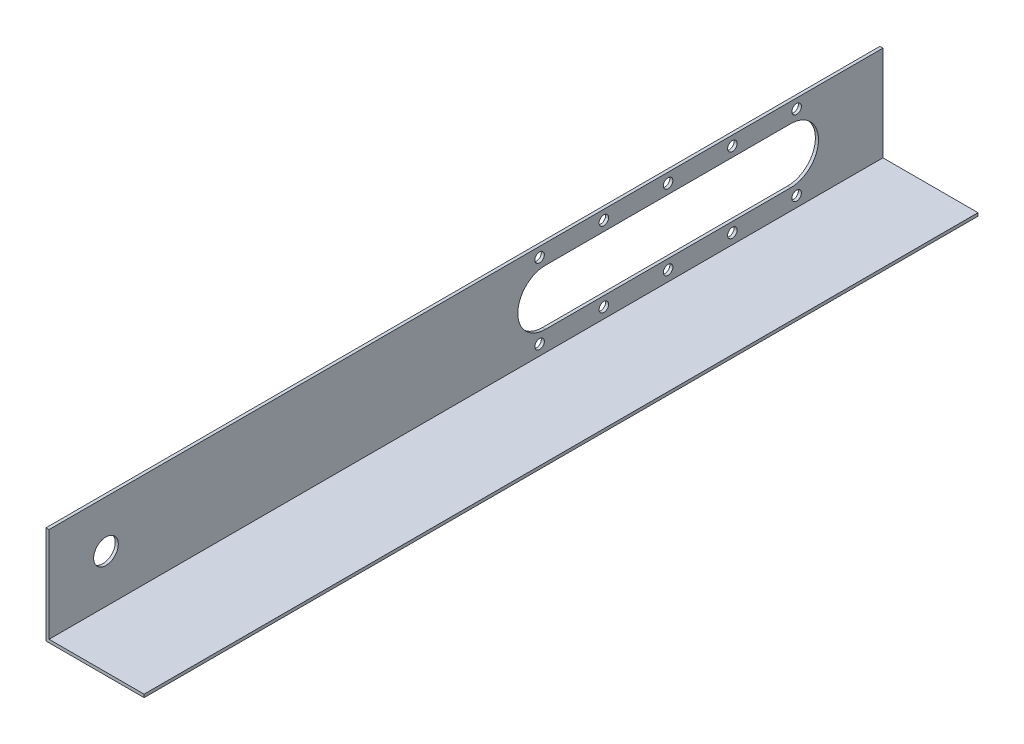
ISO-10303-21;
HEADER;
FILE_DESCRIPTION(('STEP AP214'),'2;1');
FILE_NAME('part.step','',(''),(''),'','','');
FILE_SCHEMA(('AUTOMOTIVE_DESIGN { 1 0 10303 214 1 1 1 1 }'));
ENDSEC;
DATA;
#1=APPLICATION_CONTEXT('core data for automotive mechanical design processes');
#2=APPLICATION_PROTOCOL_DEFINITION('international standard','automotive_design',2000,#1);
#3=PRODUCT_CONTEXT('',#1,'mechanical');
#4=PRODUCT('Part','Part','',(#3));
#5=PRODUCT_RELATED_PRODUCT_CATEGORY('part','',(#4));
#6=PRODUCT_DEFINITION_FORMATION('','',#4);
#7=PRODUCT_DEFINITION_CONTEXT('part definition',#1,'design');
#8=PRODUCT_DEFINITION('design','',#6,#7);
#9=PRODUCT_DEFINITION_SHAPE('','',#8);
#10=(LENGTH_UNIT() NAMED_UNIT(*) SI_UNIT(.MILLI.,.METRE.));
#11=(NAMED_UNIT(*) PLANE_ANGLE_UNIT() SI_UNIT($,.RADIAN.));
#12=(NAMED_UNIT(*) SI_UNIT($,.STERADIAN.) SOLID_ANGLE_UNIT());
#13=UNCERTAINTY_MEASURE_WITH_UNIT(LENGTH_MEASURE(1.E-05),#10,'distance_accuracy_value','');
#14=(GEOMETRIC_REPRESENTATION_CONTEXT(3) GLOBAL_UNCERTAINTY_ASSIGNED_CONTEXT((#13)) GLOBAL_UNIT_ASSIGNED_CONTEXT((#10,
#11,#12)) REPRESENTATION_CONTEXT('',''));
#15=CARTESIAN_POINT('',(0.,0.,0.));
#16=DIRECTION('',(0.,0.,1.));
#17=DIRECTION('',(1.,0.,0.));
#18=AXIS2_PLACEMENT_3D('',#15,#16,#17);
#19=CARTESIAN_POINT('',(0.,0.,431.8));
#20=DIRECTION('',(-1.,0.,0.));
#21=DIRECTION('',(0.,-1.,0.));
#22=AXIS2_PLACEMENT_3D('',#19,#20,#21);
#23=PLANE('',#22);
#24=CARTESIAN_POINT('',(0.,44.2595,111.252));
#25=DIRECTION('',(1.,0.,0.));
#26=DIRECTION('',(0.,0.,-1.));
#27=AXIS2_PLACEMENT_3D('',#24,#25,#26);
#28=CIRCLE('',#27,2.45744999999999);
#29=CARTESIAN_POINT('',(0.,44.2595,108.79455));
#30=VERTEX_POINT('',#29);
#31=EDGE_CURVE('E457',#30,#30,#28,.T.);
#32=ORIENTED_EDGE('',*,*,#31,.F.);
#33=EDGE_LOOP('',(#32));
#34=FACE_BOUND('',#33,.T.);
#35=CARTESIAN_POINT('',(0.,44.2595,144.526));
#36=DIRECTION('',(1.,0.,0.));
#37=DIRECTION('',(0.,0.,-1.));
#38=AXIS2_PLACEMENT_3D('',#35,#36,#37);
#39=CIRCLE('',#38,2.45744999999999);
#40=CARTESIAN_POINT('',(0.,44.2595,142.06855));
#41=VERTEX_POINT('',#40);
#42=EDGE_CURVE('E261',#41,#41,#39,.T.);
#43=ORIENTED_EDGE('',*,*,#42,.F.);
#44=EDGE_LOOP('',(#43));
#45=FACE_BOUND('',#44,.T.);
#46=CARTESIAN_POINT('',(0.,5.39749999999999,111.252));
#47=DIRECTION('',(1.,0.,0.));
#48=DIRECTION('',(0.,0.,-1.));
#49=AXIS2_PLACEMENT_3D('',#46,#47,#48);
#50=CIRCLE('',#49,2.45744999999999);
#51=CARTESIAN_POINT('',(0.,5.39749999999999,108.79455));
#52=VERTEX_POINT('',#51);
#53=EDGE_CURVE('E258',#52,#52,#50,.T.);
#54=ORIENTED_EDGE('',*,*,#53,.F.);
#55=EDGE_LOOP('',(#54));
#56=FACE_BOUND('',#55,.T.);
#57=CARTESIAN_POINT('',(0.,5.39749999999999,144.526));
#58=DIRECTION('',(1.,0.,0.));
#59=DIRECTION('',(0.,0.,-1.));
#60=AXIS2_PLACEMENT_3D('',#57,#58,#59);
#61=CIRCLE('',#60,2.45744999999999);
#62=CARTESIAN_POINT('',(0.,5.39749999999999,142.06855));
#63=VERTEX_POINT('',#62);
#64=EDGE_CURVE('E270',#63,#63,#61,.T.);
#65=ORIENTED_EDGE('',*,*,#64,.F.);
#66=EDGE_LOOP('',(#65));
#67=FACE_BOUND('',#66,.T.);
#68=CARTESIAN_POINT('',(0.,5.39749999999999,177.8));
#69=DIRECTION('',(1.,0.,0.));
#70=DIRECTION('',(0.,0.,-1.));
#71=AXIS2_PLACEMENT_3D('',#68,#69,#70);
#72=CIRCLE('',#71,2.45744999999999);
#73=CARTESIAN_POINT('',(0.,5.39749999999999,175.34255));
#74=VERTEX_POINT('',#73);
#75=EDGE_CURVE('E276',#74,#74,#72,.T.);
#76=ORIENTED_EDGE('',*,*,#75,.F.);
#77=EDGE_LOOP('',(#76));
#78=FACE_BOUND('',#77,.T.);
#79=CARTESIAN_POINT('',(0.,44.2595,77.978));
#80=DIRECTION('',(1.,0.,0.));
#81=DIRECTION('',(0.,0.,-1.));
#82=AXIS2_PLACEMENT_3D('',#79,#80,#81);
#83=CIRCLE('',#82,2.45744999999999);
#84=CARTESIAN_POINT('',(0.,44.2595,75.52055));
#85=VERTEX_POINT('',#84);
#86=EDGE_CURVE('E282',#85,#85,#83,.T.);
#87=ORIENTED_EDGE('',*,*,#86,.F.);
#88=EDGE_LOOP('',(#87));
#89=FACE_BOUND('',#88,.T.);
#90=CARTESIAN_POINT('',(0.,44.2595,44.704));
#91=DIRECTION('',(1.,0.,0.));
#92=DIRECTION('',(0.,0.,-1.));
#93=AXIS2_PLACEMENT_3D('',#90,#91,#92);
#94=CIRCLE('',#93,2.45744999999999);
#95=CARTESIAN_POINT('',(0.,44.2595,42.24655));
#96=VERTEX_POINT('',#95);
#97=EDGE_CURVE('E288',#96,#96,#94,.T.);
#98=ORIENTED_EDGE('',*,*,#97,.F.);
#99=EDGE_LOOP('',(#98));
#100=FACE_BOUND('',#99,.T.);
#101=CARTESIAN_POINT('',(0.,5.39749999999999,44.704));
#102=DIRECTION('',(1.,0.,0.));
#103=DIRECTION('',(0.,0.,-1.));
#104=AXIS2_PLACEMENT_3D('',#101,#102,#103);
#105=CIRCLE('',#104,2.45744999999999);
#106=CARTESIAN_POINT('',(0.,5.39749999999999,42.24655));
#107=VERTEX_POINT('',#106);
#108=EDGE_CURVE('E294',#107,#107,#105,.T.);
#109=ORIENTED_EDGE('',*,*,#108,.F.);
#110=EDGE_LOOP('',(#109));
#111=FACE_BOUND('',#110,.T.);
#112=CARTESIAN_POINT('',(0.,5.39749999999999,77.978));
#113=DIRECTION('',(1.,0.,0.));
#114=DIRECTION('',(0.,0.,-1.));
#115=AXIS2_PLACEMENT_3D('',#112,#113,#114);
#116=CIRCLE('',#115,2.45744999999999);
#117=CARTESIAN_POINT('',(0.,5.39749999999999,75.52055));
#118=VERTEX_POINT('',#117);
#119=EDGE_CURVE('E300',#118,#118,#116,.T.);
#120=ORIENTED_EDGE('',*,*,#119,.F.);
#121=EDGE_LOOP('',(#120));
#122=FACE_BOUND('',#121,.T.);
#123=CARTESIAN_POINT('',(0.,24.7735948291677,402.336));
#124=DIRECTION('',(1.,0.,0.));
#125=DIRECTION('',(0.,1.,0.));
#126=AXIS2_PLACEMENT_3D('',#123,#124,#125);
#127=CIRCLE('',#126,6.38810000000003);
#128=CARTESIAN_POINT('',(0.,31.1616948291677,402.336));
#129=VERTEX_POINT('',#128);
#130=EDGE_CURVE('E306',#129,#129,#127,.T.);
#131=ORIENTED_EDGE('',*,*,#130,.F.);
#132=EDGE_LOOP('',(#131));
#133=FACE_BOUND('',#132,.T.);
#134=DIRECTION('',(0.,0.,-1.));
#135=VECTOR('',#134,1.);
#136=CARTESIAN_POINT('',(0.,10.4775,174.752));
#137=LINE('',#136,#135);
#138=CARTESIAN_POINT('',(0.,10.4775,174.752));
#139=VERTEX_POINT('',#138);
#140=CARTESIAN_POINT('',(0.,10.4775,47.752));
#141=VERTEX_POINT('',#140);
#142=EDGE_CURVE('E124',#139,#141,#137,.T.);
#143=ORIENTED_EDGE('',*,*,#142,.F.);
#144=CARTESIAN_POINT('',(0.,24.8285,174.752));
#145=DIRECTION('',(1.,0.,0.));
#146=DIRECTION('',(0.,1.,0.));
#147=AXIS2_PLACEMENT_3D('',#144,#145,#146);
#148=CIRCLE('',#147,14.351);
#149=CARTESIAN_POINT('',(0.,39.1795,174.752));
#150=VERTEX_POINT('',#149);
#151=EDGE_CURVE('E50',#150,#139,#148,.T.);
#152=ORIENTED_EDGE('',*,*,#151,.F.);
#153=DIRECTION('',(0.,0.,1.));
#154=VECTOR('',#153,1.);
#155=CARTESIAN_POINT('',(0.,39.1795,174.752));
#156=LINE('',#155,#154);
#157=CARTESIAN_POINT('',(0.,39.1795,47.752));
#158=VERTEX_POINT('',#157);
#159=EDGE_CURVE('E130',#158,#150,#156,.T.);
#160=ORIENTED_EDGE('',*,*,#159,.F.);
#161=CARTESIAN_POINT('',(0.,24.8285,47.752));
#162=DIRECTION('',(1.,0.,0.));
#163=DIRECTION('',(0.,1.,0.));
#164=AXIS2_PLACEMENT_3D('',#161,#162,#163);
#165=CIRCLE('',#164,14.351);
#166=EDGE_CURVE('E115',#141,#158,#165,.T.);
#167=ORIENTED_EDGE('',*,*,#166,.F.);
#168=EDGE_LOOP('',(#143,#152,#160,#167));
#169=FACE_BOUND('',#168,.T.);
#170=DIRECTION('',(0.,1.,0.));
#171=VECTOR('',#170,1.);
#172=CARTESIAN_POINT('',(0.,0.,0.));
#173=LINE('',#172,#171);
#174=CARTESIAN_POINT('',(0.,0.,0.));
#175=VERTEX_POINT('',#174);
#176=CARTESIAN_POINT('',(0.,49.2125,0.));
#177=VERTEX_POINT('',#176);
#178=EDGE_CURVE('E157',#175,#177,#173,.T.);
#179=ORIENTED_EDGE('',*,*,#178,.T.);
#180=DIRECTION('',(0.,0.,-1.));
#181=VECTOR('',#180,1.);
#182=CARTESIAN_POINT('',(0.,49.2125,431.8));
#183=LINE('',#182,#181);
#184=CARTESIAN_POINT('',(0.,49.2125,431.8));
#185=VERTEX_POINT('',#184);
#186=EDGE_CURVE('E177',#185,#177,#183,.T.);
#187=ORIENTED_EDGE('',*,*,#186,.F.);
#188=DIRECTION('',(0.,1.,0.));
#189=VECTOR('',#188,1.);
#190=CARTESIAN_POINT('',(0.,0.,431.8));
#191=LINE('',#190,#189);
#192=CARTESIAN_POINT('',(0.,0.,431.8));
#193=VERTEX_POINT('',#192);
#194=EDGE_CURVE('E143',#193,#185,#191,.T.);
#195=ORIENTED_EDGE('',*,*,#194,.F.);
#196=DIRECTION('',(0.,0.,-1.));
#197=VECTOR('',#196,1.);
#198=CARTESIAN_POINT('',(0.,0.,431.8));
#199=LINE('',#198,#197);
#200=EDGE_CURVE('E180',#193,#175,#199,.T.);
#201=ORIENTED_EDGE('',*,*,#200,.T.);
#202=EDGE_LOOP('',(#179,#187,#195,#201));
#203=FACE_BOUND('',#202,.T.);
#204=CARTESIAN_POINT('',(0.,44.2595,177.8));
#205=DIRECTION('',(1.,0.,0.));
#206=DIRECTION('',(0.,0.,-1.));
#207=AXIS2_PLACEMENT_3D('',#204,#205,#206);
#208=CIRCLE('',#207,2.45744999999999);
#209=CARTESIAN_POINT('',(0.,44.2595,175.34255));
#210=VERTEX_POINT('',#209);
#211=EDGE_CURVE('E252',#210,#210,#208,.T.);
#212=ORIENTED_EDGE('',*,*,#211,.F.);
#213=EDGE_LOOP('',(#212));
#214=FACE_BOUND('',#213,.T.);
#215=ADVANCED_FACE('F35',(#34,#45,#56,#67,#78,#89,#100,#111,#122,#133,#169,#203,#214),#23,.F.);
#216=CARTESIAN_POINT('',(49.2125,0.,431.8));
#217=DIRECTION('',(0.,-1.,0.));
#218=DIRECTION('',(1.,0.,0.));
#219=AXIS2_PLACEMENT_3D('',#216,#217,#218);
#220=PLANE('',#219);
#221=DIRECTION('',(-1.,0.,0.));
#222=VECTOR('',#221,1.);
#223=CARTESIAN_POINT('',(49.2125,0.,0.));
#224=LINE('',#223,#222);
#225=CARTESIAN_POINT('',(49.2125,0.,0.));
#226=VERTEX_POINT('',#225);
#227=EDGE_CURVE('E137',#226,#175,#224,.T.);
#228=ORIENTED_EDGE('',*,*,#227,.T.);
#229=ORIENTED_EDGE('',*,*,#200,.F.);
#230=DIRECTION('',(-1.,0.,0.));
#231=VECTOR('',#230,1.);
#232=CARTESIAN_POINT('',(49.2125,0.,431.8));
#233=LINE('',#232,#231);
#234=CARTESIAN_POINT('',(49.2125,0.,431.8));
#235=VERTEX_POINT('',#234);
#236=EDGE_CURVE('E140',#235,#193,#233,.T.);
#237=ORIENTED_EDGE('',*,*,#236,.F.);
#238=DIRECTION('',(0.,0.,-1.));
#239=VECTOR('',#238,1.);
#240=CARTESIAN_POINT('',(49.2125,0.,431.8));
#241=LINE('',#240,#239);
#242=EDGE_CURVE('E154',#235,#226,#241,.T.);
#243=ORIENTED_EDGE('',*,*,#242,.T.);
#244=EDGE_LOOP('',(#228,#229,#237,#243));
#245=FACE_BOUND('',#244,.T.);
#246=ADVANCED_FACE('F37',(#245),#220,.F.);
#247=CARTESIAN_POINT('',(0.,49.2125,431.8));
#248=DIRECTION('',(0.,-1.,0.));
#249=DIRECTION('',(1.,0.,0.));
#250=AXIS2_PLACEMENT_3D('',#247,#248,#249);
#251=PLANE('',#250);
#252=DIRECTION('',(-1.,0.,0.));
#253=VECTOR('',#252,1.);
#254=CARTESIAN_POINT('',(0.,49.2125,0.));
#255=LINE('',#254,#253);
#256=CARTESIAN_POINT('',(-1.5875,49.2125,0.));
#257=VERTEX_POINT('',#256);
#258=EDGE_CURVE('E159',#177,#257,#255,.T.);
#259=ORIENTED_EDGE('',*,*,#258,.T.);
#260=DIRECTION('',(0.,0.,-1.));
#261=VECTOR('',#260,1.);
#262=CARTESIAN_POINT('',(-1.5875,49.2125,431.8));
#263=LINE('',#262,#261);
#264=CARTESIAN_POINT('',(-1.5875,49.2125,431.8));
#265=VERTEX_POINT('',#264);
#266=EDGE_CURVE('E174',#265,#257,#263,.T.);
#267=ORIENTED_EDGE('',*,*,#266,.F.);
#268=DIRECTION('',(-1.,0.,0.));
#269=VECTOR('',#268,1.);
#270=CARTESIAN_POINT('',(0.,49.2125,431.8));
#271=LINE('',#270,#269);
#272=EDGE_CURVE('E146',#185,#265,#271,.T.);
#273=ORIENTED_EDGE('',*,*,#272,.F.);
#274=ORIENTED_EDGE('',*,*,#186,.T.);
#275=EDGE_LOOP('',(#259,#267,#273,#274));
#276=FACE_BOUND('',#275,.T.);
#277=ADVANCED_FACE('F211',(#276),#251,.F.);
#278=CARTESIAN_POINT('',(-1.5875,49.2125,431.8));
#279=DIRECTION('',(1.,0.,0.));
#280=DIRECTION('',(0.,1.,0.));
#281=AXIS2_PLACEMENT_3D('',#278,#279,#280);
#282=PLANE('',#281);
#283=CARTESIAN_POINT('',(-1.58750000000001,44.2595,111.252));
#284=DIRECTION('',(1.,0.,0.));
#285=DIRECTION('',(0.,0.,-1.));
#286=AXIS2_PLACEMENT_3D('',#283,#284,#285);
#287=CIRCLE('',#286,2.45745);
#288=CARTESIAN_POINT('',(-1.58750000000001,44.2595,108.79455));
#289=VERTEX_POINT('',#288);
#290=EDGE_CURVE('E455',#289,#289,#287,.T.);
#291=ORIENTED_EDGE('',*,*,#290,.T.);
#292=EDGE_LOOP('',(#291));
#293=FACE_BOUND('',#292,.T.);
#294=CARTESIAN_POINT('',(-1.58750000000001,44.2595,144.526));
#295=DIRECTION('',(1.,0.,0.));
#296=DIRECTION('',(0.,0.,-1.));
#297=AXIS2_PLACEMENT_3D('',#294,#295,#296);
#298=CIRCLE('',#297,2.45745);
#299=CARTESIAN_POINT('',(-1.58750000000001,44.2595,142.06855));
#300=VERTEX_POINT('',#299);
#301=EDGE_CURVE('E255',#300,#300,#298,.T.);
#302=ORIENTED_EDGE('',*,*,#301,.T.);
#303=EDGE_LOOP('',(#302));
#304=FACE_BOUND('',#303,.T.);
#305=CARTESIAN_POINT('',(-1.58750000000001,44.2595,177.8));
#306=DIRECTION('',(1.,0.,0.));
#307=DIRECTION('',(0.,0.,-1.));
#308=AXIS2_PLACEMENT_3D('',#305,#306,#307);
#309=CIRCLE('',#308,2.45745);
#310=CARTESIAN_POINT('',(-1.58750000000001,44.2595,175.34255));
#311=VERTEX_POINT('',#310);
#312=EDGE_CURVE('E254',#311,#311,#309,.T.);
#313=ORIENTED_EDGE('',*,*,#312,.T.);
#314=EDGE_LOOP('',(#313));
#315=FACE_BOUND('',#314,.T.);
#316=CARTESIAN_POINT('',(-1.58750000000001,5.39749999999999,111.252));
#317=DIRECTION('',(1.,0.,0.));
#318=DIRECTION('',(0.,0.,-1.));
#319=AXIS2_PLACEMENT_3D('',#316,#317,#318);
#320=CIRCLE('',#319,2.45745);
#321=CARTESIAN_POINT('',(-1.58750000000001,5.39749999999999,108.79455));
#322=VERTEX_POINT('',#321);
#323=EDGE_CURVE('E267',#322,#322,#320,.T.);
#324=ORIENTED_EDGE('',*,*,#323,.T.);
#325=EDGE_LOOP('',(#324));
#326=FACE_BOUND('',#325,.T.);
#327=CARTESIAN_POINT('',(-1.58750000000001,5.39749999999999,144.526));
#328=DIRECTION('',(1.,0.,0.));
#329=DIRECTION('',(0.,0.,-1.));
#330=AXIS2_PLACEMENT_3D('',#327,#328,#329);
#331=CIRCLE('',#330,2.45745);
#332=CARTESIAN_POINT('',(-1.58750000000001,5.39749999999999,142.06855));
#333=VERTEX_POINT('',#332);
#334=EDGE_CURVE('E273',#333,#333,#331,.T.);
#335=ORIENTED_EDGE('',*,*,#334,.T.);
#336=EDGE_LOOP('',(#335));
#337=FACE_BOUND('',#336,.T.);
#338=CARTESIAN_POINT('',(-1.58750000000001,5.39749999999999,177.8));
#339=DIRECTION('',(1.,0.,0.));
#340=DIRECTION('',(0.,0.,-1.));
#341=AXIS2_PLACEMENT_3D('',#338,#339,#340);
#342=CIRCLE('',#341,2.45745);
#343=CARTESIAN_POINT('',(-1.58750000000001,5.39749999999999,175.34255));
#344=VERTEX_POINT('',#343);
#345=EDGE_CURVE('E279',#344,#344,#342,.T.);
#346=ORIENTED_EDGE('',*,*,#345,.T.);
#347=EDGE_LOOP('',(#346));
#348=FACE_BOUND('',#347,.T.);
#349=CARTESIAN_POINT('',(-1.58750000000001,44.2595,77.978));
#350=DIRECTION('',(1.,0.,0.));
#351=DIRECTION('',(0.,0.,-1.));
#352=AXIS2_PLACEMENT_3D('',#349,#350,#351);
#353=CIRCLE('',#352,2.45745);
#354=CARTESIAN_POINT('',(-1.58750000000001,44.2595,75.52055));
#355=VERTEX_POINT('',#354);
#356=EDGE_CURVE('E285',#355,#355,#353,.T.);
#357=ORIENTED_EDGE('',*,*,#356,.T.);
#358=EDGE_LOOP('',(#357));
#359=FACE_BOUND('',#358,.T.);
#360=CARTESIAN_POINT('',(-1.58750000000001,44.2595,44.704));
#361=DIRECTION('',(1.,0.,0.));
#362=DIRECTION('',(0.,0.,-1.));
#363=AXIS2_PLACEMENT_3D('',#360,#361,#362);
#364=CIRCLE('',#363,2.45745);
#365=CARTESIAN_POINT('',(-1.58750000000001,44.2595,42.24655));
#366=VERTEX_POINT('',#365);
#367=EDGE_CURVE('E291',#366,#366,#364,.T.);
#368=ORIENTED_EDGE('',*,*,#367,.T.);
#369=EDGE_LOOP('',(#368));
#370=FACE_BOUND('',#369,.T.);
#371=CARTESIAN_POINT('',(-1.58750000000001,5.39749999999999,44.704));
#372=DIRECTION('',(1.,0.,0.));
#373=DIRECTION('',(0.,0.,-1.));
#374=AXIS2_PLACEMENT_3D('',#371,#372,#373);
#375=CIRCLE('',#374,2.45745);
#376=CARTESIAN_POINT('',(-1.58750000000001,5.39749999999999,42.24655));
#377=VERTEX_POINT('',#376);
#378=EDGE_CURVE('E297',#377,#377,#375,.T.);
#379=ORIENTED_EDGE('',*,*,#378,.T.);
#380=EDGE_LOOP('',(#379));
#381=FACE_BOUND('',#380,.T.);
#382=CARTESIAN_POINT('',(-1.58750000000001,5.39749999999999,77.978));
#383=DIRECTION('',(1.,0.,0.));
#384=DIRECTION('',(0.,0.,-1.));
#385=AXIS2_PLACEMENT_3D('',#382,#383,#384);
#386=CIRCLE('',#385,2.45745);
#387=CARTESIAN_POINT('',(-1.58750000000001,5.39749999999999,75.52055));
#388=VERTEX_POINT('',#387);
#389=EDGE_CURVE('E303',#388,#388,#386,.T.);
#390=ORIENTED_EDGE('',*,*,#389,.T.);
#391=EDGE_LOOP('',(#390));
#392=FACE_BOUND('',#391,.T.);
#393=CARTESIAN_POINT('',(-1.58750000000001,24.7735948291677,402.336));
#394=DIRECTION('',(1.,0.,0.));
#395=DIRECTION('',(0.,1.,0.));
#396=AXIS2_PLACEMENT_3D('',#393,#394,#395);
#397=CIRCLE('',#396,6.38810000000003);
#398=CARTESIAN_POINT('',(-1.58750000000001,31.1616948291677,402.336));
#399=VERTEX_POINT('',#398);
#400=EDGE_CURVE('E307',#399,#399,#397,.T.);
#401=ORIENTED_EDGE('',*,*,#400,.T.);
#402=EDGE_LOOP('',(#401));
#403=FACE_BOUND('',#402,.T.);
#404=DIRECTION('',(0.,0.,1.));
#405=VECTOR('',#404,1.);
#406=CARTESIAN_POINT('',(-1.5875,39.1795,431.8));
#407=LINE('',#406,#405);
#408=CARTESIAN_POINT('',(-1.58749999999999,39.1795,47.752));
#409=VERTEX_POINT('',#408);
#410=CARTESIAN_POINT('',(-1.58749999999999,39.1795,174.752));
#411=VERTEX_POINT('',#410);
#412=EDGE_CURVE('E43',#409,#411,#407,.T.);
#413=ORIENTED_EDGE('',*,*,#412,.T.);
#414=CARTESIAN_POINT('',(-1.58749999999999,24.8285,174.752));
#415=DIRECTION('',(1.,0.,0.));
#416=DIRECTION('',(0.,1.,0.));
#417=AXIS2_PLACEMENT_3D('',#414,#415,#416);
#418=CIRCLE('',#417,14.351);
#419=CARTESIAN_POINT('',(-1.58749999999999,10.4775,174.752));
#420=VERTEX_POINT('',#419);
#421=EDGE_CURVE('E11',#411,#420,#418,.T.);
#422=ORIENTED_EDGE('',*,*,#421,.T.);
#423=DIRECTION('',(0.,0.,-1.));
#424=VECTOR('',#423,1.);
#425=CARTESIAN_POINT('',(-1.5875,10.4775,431.8));
#426=LINE('',#425,#424);
#427=CARTESIAN_POINT('',(-1.5875,10.4775,47.752));
#428=VERTEX_POINT('',#427);
#429=EDGE_CURVE('E183',#420,#428,#426,.T.);
#430=ORIENTED_EDGE('',*,*,#429,.T.);
#431=CARTESIAN_POINT('',(-1.58749999999999,24.8285,47.752));
#432=DIRECTION('',(1.,0.,0.));
#433=DIRECTION('',(0.,1.,0.));
#434=AXIS2_PLACEMENT_3D('',#431,#432,#433);
#435=CIRCLE('',#434,14.351);
#436=EDGE_CURVE('E118',#428,#409,#435,.T.);
#437=ORIENTED_EDGE('',*,*,#436,.T.);
#438=EDGE_LOOP('',(#413,#422,#430,#437));
#439=FACE_BOUND('',#438,.T.);
#440=DIRECTION('',(0.,-1.,0.));
#441=VECTOR('',#440,1.);
#442=CARTESIAN_POINT('',(-1.5875,49.2125,0.));
#443=LINE('',#442,#441);
#444=CARTESIAN_POINT('',(-1.58750000000001,-1.5875,0.));
#445=VERTEX_POINT('',#444);
#446=EDGE_CURVE('E161',#257,#445,#443,.T.);
#447=ORIENTED_EDGE('',*,*,#446,.T.);
#448=DIRECTION('',(0.,0.,-1.));
#449=VECTOR('',#448,1.);
#450=CARTESIAN_POINT('',(-1.58750000000001,-1.5875,431.8));
#451=LINE('',#450,#449);
#452=CARTESIAN_POINT('',(-1.58750000000001,-1.5875,431.8));
#453=VERTEX_POINT('',#452);
#454=EDGE_CURVE('E171',#453,#445,#451,.T.);
#455=ORIENTED_EDGE('',*,*,#454,.F.);
#456=DIRECTION('',(0.,-1.,0.));
#457=VECTOR('',#456,1.);
#458=CARTESIAN_POINT('',(-1.5875,49.2125,431.8));
#459=LINE('',#458,#457);
#460=EDGE_CURVE('E148',#265,#453,#459,.T.);
#461=ORIENTED_EDGE('',*,*,#460,.F.);
#462=ORIENTED_EDGE('',*,*,#266,.T.);
#463=EDGE_LOOP('',(#447,#455,#461,#462));
#464=FACE_BOUND('',#463,.T.);
#465=ADVANCED_FACE('F187',(#293,#304,#315,#326,#337,#348,#359,#370,#381,#392,#403,#439,#464),
#282,.F.);
#466=CARTESIAN_POINT('',(-1.58750000000001,-1.5875,431.8));
#467=DIRECTION('',(0.,1.,0.));
#468=DIRECTION('',(-1.,0.,0.));
#469=AXIS2_PLACEMENT_3D('',#466,#467,#468);
#470=PLANE('',#469);
#471=DIRECTION('',(1.,0.,0.));
#472=VECTOR('',#471,1.);
#473=CARTESIAN_POINT('',(-1.58750000000001,-1.5875,0.));
#474=LINE('',#473,#472);
#475=CARTESIAN_POINT('',(49.2125,-1.58749999999999,0.));
#476=VERTEX_POINT('',#475);
#477=EDGE_CURVE('E163',#445,#476,#474,.T.);
#478=ORIENTED_EDGE('',*,*,#477,.T.);
#479=DIRECTION('',(0.,0.,-1.));
#480=VECTOR('',#479,1.);
#481=CARTESIAN_POINT('',(49.2125,-1.58749999999999,431.8));
#482=LINE('',#481,#480);
#483=CARTESIAN_POINT('',(49.2125,-1.58749999999999,431.8));
#484=VERTEX_POINT('',#483);
#485=EDGE_CURVE('E168',#484,#476,#482,.T.);
#486=ORIENTED_EDGE('',*,*,#485,.F.);
#487=DIRECTION('',(1.,0.,0.));
#488=VECTOR('',#487,1.);
#489=CARTESIAN_POINT('',(-1.58750000000001,-1.5875,431.8));
#490=LINE('',#489,#488);
#491=EDGE_CURVE('E150',#453,#484,#490,.T.);
#492=ORIENTED_EDGE('',*,*,#491,.F.);
#493=ORIENTED_EDGE('',*,*,#454,.T.);
#494=EDGE_LOOP('',(#478,#486,#492,#493));
#495=FACE_BOUND('',#494,.T.);
#496=ADVANCED_FACE('F221',(#495),#470,.F.);
#497=CARTESIAN_POINT('',(49.2125,-1.58749999999999,431.8));
#498=DIRECTION('',(-1.,0.,0.));
#499=DIRECTION('',(0.,-1.,0.));
#500=AXIS2_PLACEMENT_3D('',#497,#498,#499);
#501=PLANE('',#500);
#502=DIRECTION('',(0.,1.,0.));
#503=VECTOR('',#502,1.);
#504=CARTESIAN_POINT('',(49.2125,-1.58749999999999,0.));
#505=LINE('',#504,#503);
#506=EDGE_CURVE('E144',#476,#226,#505,.T.);
#507=ORIENTED_EDGE('',*,*,#506,.T.);
#508=ORIENTED_EDGE('',*,*,#242,.F.);
#509=DIRECTION('',(0.,1.,0.));
#510=VECTOR('',#509,1.);
#511=CARTESIAN_POINT('',(49.2125,-1.58749999999999,431.8));
#512=LINE('',#511,#510);
#513=EDGE_CURVE('E152',#484,#235,#512,.T.);
#514=ORIENTED_EDGE('',*,*,#513,.F.);
#515=ORIENTED_EDGE('',*,*,#485,.T.);
#516=EDGE_LOOP('',(#507,#508,#514,#515));
#517=FACE_BOUND('',#516,.T.);
#518=ADVANCED_FACE('F225',(#517),#501,.F.);
#519=CARTESIAN_POINT('',(0.,0.,431.8));
#520=DIRECTION('',(0.,0.,-1.));
#521=DIRECTION('',(-1.,0.,0.));
#522=AXIS2_PLACEMENT_3D('',#519,#520,#521);
#523=PLANE('',#522);
#524=ORIENTED_EDGE('',*,*,#236,.T.);
#525=ORIENTED_EDGE('',*,*,#194,.T.);
#526=ORIENTED_EDGE('',*,*,#272,.T.);
#527=ORIENTED_EDGE('',*,*,#460,.T.);
#528=ORIENTED_EDGE('',*,*,#491,.T.);
#529=ORIENTED_EDGE('',*,*,#513,.T.);
#530=EDGE_LOOP('',(#524,#525,#526,#527,#528,#529));
#531=FACE_BOUND('',#530,.T.);
#532=ADVANCED_FACE('F201',(#531),#523,.F.);
#533=CARTESIAN_POINT('',(0.,0.,0.));
#534=DIRECTION('',(0.,0.,-1.));
#535=DIRECTION('',(-1.,0.,0.));
#536=AXIS2_PLACEMENT_3D('',#533,#534,#535);
#537=PLANE('',#536);
#538=ORIENTED_EDGE('',*,*,#227,.F.);
#539=ORIENTED_EDGE('',*,*,#506,.F.);
#540=ORIENTED_EDGE('',*,*,#477,.F.);
#541=ORIENTED_EDGE('',*,*,#446,.F.);
#542=ORIENTED_EDGE('',*,*,#258,.F.);
#543=ORIENTED_EDGE('',*,*,#178,.F.);
#544=EDGE_LOOP('',(#538,#539,#540,#541,#542,#543));
#545=FACE_BOUND('',#544,.T.);
#546=ADVANCED_FACE('F194',(#545),#537,.T.);
#547=CARTESIAN_POINT('',(-127.,24.8285,174.752));
#548=DIRECTION('',(1.,0.,0.));
#549=DIRECTION('',(0.,1.,0.));
#550=AXIS2_PLACEMENT_3D('',#547,#548,#549);
#551=CYLINDRICAL_SURFACE('',#550,14.351);
#552=DIRECTION('',(1.,0.,0.));
#553=VECTOR('',#552,1.);
#554=CARTESIAN_POINT('',(-127.,39.1795,174.752));
#555=LINE('',#554,#553);
#556=EDGE_CURVE('E135',#411,#150,#555,.T.);
#557=ORIENTED_EDGE('',*,*,#556,.T.);
#558=ORIENTED_EDGE('',*,*,#151,.T.);
#559=DIRECTION('',(1.,0.,0.));
#560=VECTOR('',#559,1.);
#561=CARTESIAN_POINT('',(-127.,10.4775,174.752));
#562=LINE('',#561,#560);
#563=EDGE_CURVE('E121',#420,#139,#562,.T.);
#564=ORIENTED_EDGE('',*,*,#563,.F.);
#565=ORIENTED_EDGE('',*,*,#421,.F.);
#566=EDGE_LOOP('',(#557,#558,#564,#565));
#567=FACE_BOUND('',#566,.T.);
#568=ADVANCED_FACE('F192',(#567),#551,.F.);
#569=CARTESIAN_POINT('',(-127.,39.1795,174.752));
#570=DIRECTION('',(0.,1.,0.));
#571=DIRECTION('',(-1.,0.,0.));
#572=AXIS2_PLACEMENT_3D('',#569,#570,#571);
#573=PLANE('',#572);
#574=DIRECTION('',(1.,0.,0.));
#575=VECTOR('',#574,1.);
#576=CARTESIAN_POINT('',(-127.,39.1795,47.752));
#577=LINE('',#576,#575);
#578=EDGE_CURVE('E120',#409,#158,#577,.T.);
#579=ORIENTED_EDGE('',*,*,#578,.T.);
#580=ORIENTED_EDGE('',*,*,#159,.T.);
#581=ORIENTED_EDGE('',*,*,#556,.F.);
#582=ORIENTED_EDGE('',*,*,#412,.F.);
#583=EDGE_LOOP('',(#579,#580,#581,#582));
#584=FACE_BOUND('',#583,.T.);
#585=ADVANCED_FACE('F191',(#584),#573,.F.);
#586=CARTESIAN_POINT('',(-127.,24.8285,47.752));
#587=DIRECTION('',(1.,0.,0.));
#588=DIRECTION('',(0.,1.,0.));
#589=AXIS2_PLACEMENT_3D('',#586,#587,#588);
#590=CYLINDRICAL_SURFACE('',#589,14.351);
#591=DIRECTION('',(1.,0.,0.));
#592=VECTOR('',#591,1.);
#593=CARTESIAN_POINT('',(-127.,10.4775,47.752));
#594=LINE('',#593,#592);
#595=EDGE_CURVE('E58',#428,#141,#594,.T.);
#596=ORIENTED_EDGE('',*,*,#595,.T.);
#597=ORIENTED_EDGE('',*,*,#166,.T.);
#598=ORIENTED_EDGE('',*,*,#578,.F.);
#599=ORIENTED_EDGE('',*,*,#436,.F.);
#600=EDGE_LOOP('',(#596,#597,#598,#599));
#601=FACE_BOUND('',#600,.T.);
#602=ADVANCED_FACE('F112',(#601),#590,.F.);
#603=CARTESIAN_POINT('',(-127.,10.4775,174.752));
#604=DIRECTION('',(0.,-1.,0.));
#605=DIRECTION('',(1.,0.,0.));
#606=AXIS2_PLACEMENT_3D('',#603,#604,#605);
#607=PLANE('',#606);
#608=ORIENTED_EDGE('',*,*,#563,.T.);
#609=ORIENTED_EDGE('',*,*,#142,.T.);
#610=ORIENTED_EDGE('',*,*,#595,.F.);
#611=ORIENTED_EDGE('',*,*,#429,.F.);
#612=EDGE_LOOP('',(#608,#609,#610,#611));
#613=FACE_BOUND('',#612,.T.);
#614=ADVANCED_FACE('F125',(#613),#607,.F.);
#615=CARTESIAN_POINT('',(-1.58750000000001,24.7735948291677,402.336));
#616=DIRECTION('',(1.,0.,0.));
#617=DIRECTION('',(0.,1.,0.));
#618=AXIS2_PLACEMENT_3D('',#615,#616,#617);
#619=CYLINDRICAL_SURFACE('',#618,6.38810000000003);
#620=ORIENTED_EDGE('',*,*,#400,.F.);
#621=EDGE_LOOP('',(#620));
#622=FACE_BOUND('',#621,.T.);
#623=ORIENTED_EDGE('',*,*,#130,.T.);
#624=EDGE_LOOP('',(#623));
#625=FACE_BOUND('',#624,.T.);
#626=ADVANCED_FACE('F313',(#622,#625),#619,.F.);
#627=CARTESIAN_POINT('',(0.,5.39749999999999,77.978));
#628=DIRECTION('',(1.,0.,0.));
#629=DIRECTION('',(0.,0.,-1.));
#630=AXIS2_PLACEMENT_3D('',#627,#628,#629);
#631=CYLINDRICAL_SURFACE('',#630,2.45744999999999);
#632=ORIENTED_EDGE('',*,*,#389,.F.);
#633=EDGE_LOOP('',(#632));
#634=FACE_BOUND('',#633,.T.);
#635=ORIENTED_EDGE('',*,*,#119,.T.);
#636=EDGE_LOOP('',(#635));
#637=FACE_BOUND('',#636,.T.);
#638=ADVANCED_FACE('F316',(#634,#637),#631,.F.);
#639=CARTESIAN_POINT('',(0.,5.39749999999999,44.704));
#640=DIRECTION('',(1.,0.,0.));
#641=DIRECTION('',(0.,0.,-1.));
#642=AXIS2_PLACEMENT_3D('',#639,#640,#641);
#643=CYLINDRICAL_SURFACE('',#642,2.45744999999999);
#644=ORIENTED_EDGE('',*,*,#378,.F.);
#645=EDGE_LOOP('',(#644));
#646=FACE_BOUND('',#645,.T.);
#647=ORIENTED_EDGE('',*,*,#108,.T.);
#648=EDGE_LOOP('',(#647));
#649=FACE_BOUND('',#648,.T.);
#650=ADVANCED_FACE('F323',(#646,#649),#643,.F.);
#651=CARTESIAN_POINT('',(0.,44.2595,44.704));
#652=DIRECTION('',(1.,0.,0.));
#653=DIRECTION('',(0.,0.,-1.));
#654=AXIS2_PLACEMENT_3D('',#651,#652,#653);
#655=CYLINDRICAL_SURFACE('',#654,2.45744999999999);
#656=ORIENTED_EDGE('',*,*,#367,.F.);
#657=EDGE_LOOP('',(#656));
#658=FACE_BOUND('',#657,.T.);
#659=ORIENTED_EDGE('',*,*,#97,.T.);
#660=EDGE_LOOP('',(#659));
#661=FACE_BOUND('',#660,.T.);
#662=ADVANCED_FACE('F369',(#658,#661),#655,.F.);
#663=CARTESIAN_POINT('',(0.,44.2595,77.978));
#664=DIRECTION('',(1.,0.,0.));
#665=DIRECTION('',(0.,0.,-1.));
#666=AXIS2_PLACEMENT_3D('',#663,#664,#665);
#667=CYLINDRICAL_SURFACE('',#666,2.45744999999999);
#668=ORIENTED_EDGE('',*,*,#356,.F.);
#669=EDGE_LOOP('',(#668));
#670=FACE_BOUND('',#669,.T.);
#671=ORIENTED_EDGE('',*,*,#86,.T.);
#672=EDGE_LOOP('',(#671));
#673=FACE_BOUND('',#672,.T.);
#674=ADVANCED_FACE('F378',(#670,#673),#667,.F.);
#675=CARTESIAN_POINT('',(0.,5.39749999999999,177.8));
#676=DIRECTION('',(1.,0.,0.));
#677=DIRECTION('',(0.,0.,-1.));
#678=AXIS2_PLACEMENT_3D('',#675,#676,#677);
#679=CYLINDRICAL_SURFACE('',#678,2.45744999999999);
#680=ORIENTED_EDGE('',*,*,#345,.F.);
#681=EDGE_LOOP('',(#680));
#682=FACE_BOUND('',#681,.T.);
#683=ORIENTED_EDGE('',*,*,#75,.T.);
#684=EDGE_LOOP('',(#683));
#685=FACE_BOUND('',#684,.T.);
#686=ADVANCED_FACE('F388',(#682,#685),#679,.F.);
#687=CARTESIAN_POINT('',(0.,5.39749999999999,144.526));
#688=DIRECTION('',(1.,0.,0.));
#689=DIRECTION('',(0.,0.,-1.));
#690=AXIS2_PLACEMENT_3D('',#687,#688,#689);
#691=CYLINDRICAL_SURFACE('',#690,2.45744999999999);
#692=ORIENTED_EDGE('',*,*,#334,.F.);
#693=EDGE_LOOP('',(#692));
#694=FACE_BOUND('',#693,.T.);
#695=ORIENTED_EDGE('',*,*,#64,.T.);
#696=EDGE_LOOP('',(#695));
#697=FACE_BOUND('',#696,.T.);
#698=ADVANCED_FACE('F398',(#694,#697),#691,.F.);
#699=CARTESIAN_POINT('',(0.,5.39749999999999,111.252));
#700=DIRECTION('',(1.,0.,0.));
#701=DIRECTION('',(0.,0.,-1.));
#702=AXIS2_PLACEMENT_3D('',#699,#700,#701);
#703=CYLINDRICAL_SURFACE('',#702,2.45744999999999);
#704=ORIENTED_EDGE('',*,*,#323,.F.);
#705=EDGE_LOOP('',(#704));
#706=FACE_BOUND('',#705,.T.);
#707=ORIENTED_EDGE('',*,*,#53,.T.);
#708=EDGE_LOOP('',(#707));
#709=FACE_BOUND('',#708,.T.);
#710=ADVANCED_FACE('F408',(#706,#709),#703,.F.);
#711=CARTESIAN_POINT('',(0.,44.2595,177.8));
#712=DIRECTION('',(1.,0.,0.));
#713=DIRECTION('',(0.,0.,-1.));
#714=AXIS2_PLACEMENT_3D('',#711,#712,#713);
#715=CYLINDRICAL_SURFACE('',#714,2.45744999999999);
#716=ORIENTED_EDGE('',*,*,#312,.F.);
#717=EDGE_LOOP('',(#716));
#718=FACE_BOUND('',#717,.T.);
#719=ORIENTED_EDGE('',*,*,#211,.T.);
#720=EDGE_LOOP('',(#719));
#721=FACE_BOUND('',#720,.T.);
#722=ADVANCED_FACE('F418',(#718,#721),#715,.F.);
#723=CARTESIAN_POINT('',(0.,44.2595,144.526));
#724=DIRECTION('',(1.,0.,0.));
#725=DIRECTION('',(0.,0.,-1.));
#726=AXIS2_PLACEMENT_3D('',#723,#724,#725);
#727=CYLINDRICAL_SURFACE('',#726,2.45744999999999);
#728=ORIENTED_EDGE('',*,*,#301,.F.);
#729=EDGE_LOOP('',(#728));
#730=FACE_BOUND('',#729,.T.);
#731=ORIENTED_EDGE('',*,*,#42,.T.);
#732=EDGE_LOOP('',(#731));
#733=FACE_BOUND('',#732,.T.);
#734=ADVANCED_FACE('F428',(#730,#733),#727,.F.);
#735=CARTESIAN_POINT('',(0.,44.2595,111.252));
#736=DIRECTION('',(1.,0.,0.));
#737=DIRECTION('',(0.,0.,-1.));
#738=AXIS2_PLACEMENT_3D('',#735,#736,#737);
#739=CYLINDRICAL_SURFACE('',#738,2.45744999999999);
#740=ORIENTED_EDGE('',*,*,#290,.F.);
#741=EDGE_LOOP('',(#740));
#742=FACE_BOUND('',#741,.T.);
#743=ORIENTED_EDGE('',*,*,#31,.T.);
#744=EDGE_LOOP('',(#743));
#745=FACE_BOUND('',#744,.T.);
#746=ADVANCED_FACE('F438',(#742,#745),#739,.F.);
#747=CLOSED_SHELL('',(#215,#246,#277,#465,#496,#518,#532,#546,#568,#585,#602,#614,#626,#638,
#650,#662,#674,#686,#698,#710,#722,#734,#746));
#748=MANIFOLD_SOLID_BREP('B2',#747);
#749=ADVANCED_BREP_SHAPE_REPRESENTATION('',(#18,#748),#14);
#750=SHAPE_DEFINITION_REPRESENTATION(#9,#749);
ENDSEC;
END-ISO-10303-21;
